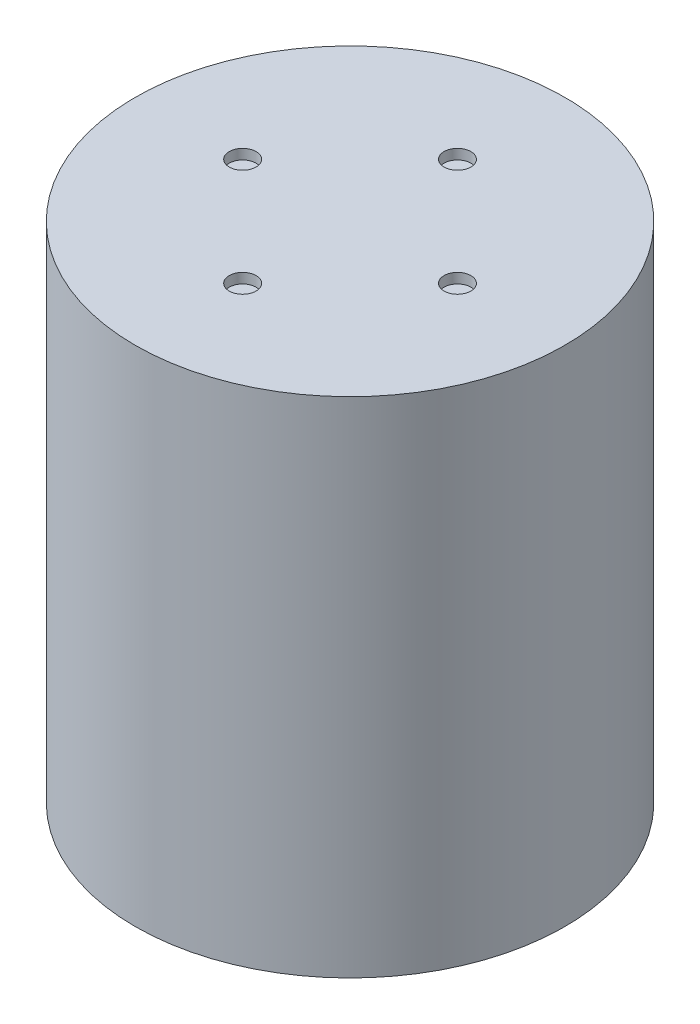
ISO-10303-21;
HEADER;
FILE_DESCRIPTION(('STEP AP214'),'2;1');
FILE_NAME('part.step','',(''),(''),'','','');
FILE_SCHEMA(('AUTOMOTIVE_DESIGN { 1 0 10303 214 1 1 1 1 }'));
ENDSEC;
DATA;
#1=APPLICATION_CONTEXT('core data for automotive mechanical design processes');
#2=APPLICATION_PROTOCOL_DEFINITION('international standard','automotive_design',2000,#1);
#3=PRODUCT_CONTEXT('',#1,'mechanical');
#4=PRODUCT('Part','Part','',(#3));
#5=PRODUCT_RELATED_PRODUCT_CATEGORY('part','',(#4));
#6=PRODUCT_DEFINITION_FORMATION('','',#4);
#7=PRODUCT_DEFINITION_CONTEXT('part definition',#1,'design');
#8=PRODUCT_DEFINITION('design','',#6,#7);
#9=PRODUCT_DEFINITION_SHAPE('','',#8);
#10=(LENGTH_UNIT() NAMED_UNIT(*) SI_UNIT(.MILLI.,.METRE.));
#11=(NAMED_UNIT(*) PLANE_ANGLE_UNIT() SI_UNIT($,.RADIAN.));
#12=(NAMED_UNIT(*) SI_UNIT($,.STERADIAN.) SOLID_ANGLE_UNIT());
#13=UNCERTAINTY_MEASURE_WITH_UNIT(LENGTH_MEASURE(1.E-05),#10,'distance_accuracy_value','');
#14=(GEOMETRIC_REPRESENTATION_CONTEXT(3) GLOBAL_UNCERTAINTY_ASSIGNED_CONTEXT((#13)) GLOBAL_UNIT_ASSIGNED_CONTEXT((#10,
#11,#12)) REPRESENTATION_CONTEXT('',''));
#15=CARTESIAN_POINT('',(0.,0.,0.));
#16=DIRECTION('',(0.,0.,1.));
#17=DIRECTION('',(1.,0.,0.));
#18=AXIS2_PLACEMENT_3D('',#15,#16,#17);
#19=CARTESIAN_POINT('',(0.,0.,0.));
#20=DIRECTION('',(0.,1.,0.));
#21=DIRECTION('',(0.,0.,1.));
#22=AXIS2_PLACEMENT_3D('',#19,#20,#21);
#23=PLANE('',#22);
#24=CARTESIAN_POINT('',(0.,0.,0.));
#25=DIRECTION('',(0.,1.,0.));
#26=DIRECTION('',(0.,0.,1.));
#27=AXIS2_PLACEMENT_3D('',#24,#25,#26);
#28=CIRCLE('',#27,32.);
#29=CARTESIAN_POINT('',(0.,0.,32.));
#30=VERTEX_POINT('',#29);
#31=EDGE_CURVE('E43',#30,#30,#28,.T.);
#32=ORIENTED_EDGE('',*,*,#31,.F.);
#33=EDGE_LOOP('',(#32));
#34=FACE_BOUND('',#33,.T.);
#35=CARTESIAN_POINT('',(-22.,0.,0.));
#36=DIRECTION('',(0.,-1.,0.));
#37=DIRECTION('',(0.,0.,-1.));
#38=AXIS2_PLACEMENT_3D('',#35,#36,#37);
#39=CIRCLE('',#38,2.);
#40=CARTESIAN_POINT('',(-22.,0.,-2.));
#41=VERTEX_POINT('',#40);
#42=EDGE_CURVE('E104',#41,#41,#39,.T.);
#43=ORIENTED_EDGE('',*,*,#42,.F.);
#44=EDGE_LOOP('',(#43));
#45=FACE_BOUND('',#44,.T.);
#46=CARTESIAN_POINT('',(0.,0.,-22.));
#47=DIRECTION('',(0.,-1.,0.));
#48=DIRECTION('',(0.,0.,-1.));
#49=AXIS2_PLACEMENT_3D('',#46,#47,#48);
#50=CIRCLE('',#49,2.);
#51=CARTESIAN_POINT('',(0.,0.,-24.));
#52=VERTEX_POINT('',#51);
#53=EDGE_CURVE('E122',#52,#52,#50,.T.);
#54=ORIENTED_EDGE('',*,*,#53,.F.);
#55=EDGE_LOOP('',(#54));
#56=FACE_BOUND('',#55,.T.);
#57=CARTESIAN_POINT('',(22.,0.,0.));
#58=DIRECTION('',(0.,-1.,0.));
#59=DIRECTION('',(0.,0.,-1.));
#60=AXIS2_PLACEMENT_3D('',#57,#58,#59);
#61=CIRCLE('',#60,2.);
#62=CARTESIAN_POINT('',(22.,0.,-2.));
#63=VERTEX_POINT('',#62);
#64=EDGE_CURVE('E116',#63,#63,#61,.T.);
#65=ORIENTED_EDGE('',*,*,#64,.F.);
#66=EDGE_LOOP('',(#65));
#67=FACE_BOUND('',#66,.T.);
#68=CARTESIAN_POINT('',(0.,0.,22.));
#69=DIRECTION('',(0.,-1.,0.));
#70=DIRECTION('',(0.,0.,-1.));
#71=AXIS2_PLACEMENT_3D('',#68,#69,#70);
#72=CIRCLE('',#71,2.);
#73=CARTESIAN_POINT('',(0.,0.,20.));
#74=VERTEX_POINT('',#73);
#75=EDGE_CURVE('E113',#74,#74,#72,.T.);
#76=ORIENTED_EDGE('',*,*,#75,.F.);
#77=EDGE_LOOP('',(#76));
#78=FACE_BOUND('',#77,.T.);
#79=CARTESIAN_POINT('',(12.7279220613578,0.,18.3847763108502));
#80=DIRECTION('',(0.,-1.,0.));
#81=DIRECTION('',(0.,0.,-1.));
#82=AXIS2_PLACEMENT_3D('',#79,#80,#81);
#83=CIRCLE('',#82,1.);
#84=CARTESIAN_POINT('',(13.4350288425444,0.,19.0918830920368));
#85=VERTEX_POINT('',#84);
#86=CARTESIAN_POINT('',(12.0208152801713,0.,17.6776695296637));
#87=VERTEX_POINT('',#86);
#88=EDGE_CURVE('E100',#85,#87,#83,.T.);
#89=ORIENTED_EDGE('',*,*,#88,.F.);
#90=DIRECTION('',(-0.707106781186547,0.,0.707106781186548));
#91=VECTOR('',#90,1.);
#92=CARTESIAN_POINT('',(13.4350288425444,0.,19.0918830920368));
#93=LINE('',#92,#91);
#94=CARTESIAN_POINT('',(19.0918830920368,0.,13.4350288425444));
#95=VERTEX_POINT('',#94);
#96=EDGE_CURVE('E97',#95,#85,#93,.T.);
#97=ORIENTED_EDGE('',*,*,#96,.F.);
#98=CARTESIAN_POINT('',(18.3847763108502,0.,12.7279220613579));
#99=DIRECTION('',(0.,-1.,0.));
#100=DIRECTION('',(0.,0.,-1.));
#101=AXIS2_PLACEMENT_3D('',#98,#99,#100);
#102=CIRCLE('',#101,0.999999999999999);
#103=CARTESIAN_POINT('',(17.6776695296637,0.,12.0208152801713));
#104=VERTEX_POINT('',#103);
#105=EDGE_CURVE('E59',#104,#95,#102,.T.);
#106=ORIENTED_EDGE('',*,*,#105,.F.);
#107=DIRECTION('',(0.707106781186547,0.,-0.707106781186547));
#108=VECTOR('',#107,1.);
#109=CARTESIAN_POINT('',(12.0208152801713,0.,17.6776695296637));
#110=LINE('',#109,#108);
#111=EDGE_CURVE('E54',#87,#104,#110,.T.);
#112=ORIENTED_EDGE('',*,*,#111,.F.);
#113=EDGE_LOOP('',(#89,#97,#106,#112));
#114=FACE_BOUND('',#113,.T.);
#115=ADVANCED_FACE('F39',(#34,#45,#56,#67,#78,#114),#23,.F.);
#116=CARTESIAN_POINT('',(0.,75.,0.));
#117=DIRECTION('',(0.,-1.,0.));
#118=DIRECTION('',(0.,0.,-1.));
#119=AXIS2_PLACEMENT_3D('',#116,#117,#118);
#120=CYLINDRICAL_SURFACE('',#119,32.);
#121=CARTESIAN_POINT('',(0.,75.,0.));
#122=DIRECTION('',(0.,1.,0.));
#123=DIRECTION('',(0.,0.,1.));
#124=AXIS2_PLACEMENT_3D('',#121,#122,#123);
#125=CIRCLE('',#124,32.);
#126=CARTESIAN_POINT('',(0.,75.,32.));
#127=VERTEX_POINT('',#126);
#128=EDGE_CURVE('E11',#127,#127,#125,.T.);
#129=ORIENTED_EDGE('',*,*,#128,.F.);
#130=EDGE_LOOP('',(#129));
#131=FACE_BOUND('',#130,.T.);
#132=ORIENTED_EDGE('',*,*,#31,.T.);
#133=EDGE_LOOP('',(#132));
#134=FACE_BOUND('',#133,.T.);
#135=ADVANCED_FACE('F41',(#131,#134),#120,.T.);
#136=CARTESIAN_POINT('',(0.,75.,0.));
#137=DIRECTION('',(0.,1.,0.));
#138=DIRECTION('',(0.,0.,1.));
#139=AXIS2_PLACEMENT_3D('',#136,#137,#138);
#140=PLANE('',#139);
#141=CARTESIAN_POINT('',(0.,75.,-16.));
#142=DIRECTION('',(0.,1.,0.));
#143=DIRECTION('',(0.,0.,1.));
#144=AXIS2_PLACEMENT_3D('',#141,#142,#143);
#145=CIRCLE('',#144,2.);
#146=CARTESIAN_POINT('',(0.,75.,-14.));
#147=VERTEX_POINT('',#146);
#148=EDGE_CURVE('E174',#147,#147,#145,.T.);
#149=ORIENTED_EDGE('',*,*,#148,.F.);
#150=EDGE_LOOP('',(#149));
#151=FACE_BOUND('',#150,.T.);
#152=CARTESIAN_POINT('',(16.,75.,0.));
#153=DIRECTION('',(0.,1.,0.));
#154=DIRECTION('',(0.,0.,1.));
#155=AXIS2_PLACEMENT_3D('',#152,#153,#154);
#156=CIRCLE('',#155,2.);
#157=CARTESIAN_POINT('',(16.,75.,2.));
#158=VERTEX_POINT('',#157);
#159=EDGE_CURVE('E171',#158,#158,#156,.T.);
#160=ORIENTED_EDGE('',*,*,#159,.F.);
#161=EDGE_LOOP('',(#160));
#162=FACE_BOUND('',#161,.T.);
#163=CARTESIAN_POINT('',(0.,75.,16.));
#164=DIRECTION('',(0.,1.,0.));
#165=DIRECTION('',(0.,0.,1.));
#166=AXIS2_PLACEMENT_3D('',#163,#164,#165);
#167=CIRCLE('',#166,2.);
#168=CARTESIAN_POINT('',(0.,75.,18.));
#169=VERTEX_POINT('',#168);
#170=EDGE_CURVE('E165',#169,#169,#167,.T.);
#171=ORIENTED_EDGE('',*,*,#170,.F.);
#172=EDGE_LOOP('',(#171));
#173=FACE_BOUND('',#172,.T.);
#174=CARTESIAN_POINT('',(-16.,75.,0.));
#175=DIRECTION('',(0.,1.,0.));
#176=DIRECTION('',(0.,0.,1.));
#177=AXIS2_PLACEMENT_3D('',#174,#175,#176);
#178=CIRCLE('',#177,2.);
#179=CARTESIAN_POINT('',(-16.,75.,2.));
#180=VERTEX_POINT('',#179);
#181=EDGE_CURVE('E159',#180,#180,#178,.T.);
#182=ORIENTED_EDGE('',*,*,#181,.F.);
#183=EDGE_LOOP('',(#182));
#184=FACE_BOUND('',#183,.T.);
#185=ORIENTED_EDGE('',*,*,#128,.T.);
#186=EDGE_LOOP('',(#185));
#187=FACE_BOUND('',#186,.T.);
#188=ADVANCED_FACE('F189',(#151,#162,#173,#184,#187),#140,.T.);
#189=CARTESIAN_POINT('',(-22.,1.5,0.));
#190=DIRECTION('',(0.,-1.,0.));
#191=DIRECTION('',(0.,0.,-1.));
#192=AXIS2_PLACEMENT_3D('',#189,#190,#191);
#193=CYLINDRICAL_SURFACE('',#192,2.);
#194=CARTESIAN_POINT('',(-22.,1.5,0.));
#195=DIRECTION('',(0.,-1.,0.));
#196=DIRECTION('',(0.,0.,-1.));
#197=AXIS2_PLACEMENT_3D('',#194,#195,#196);
#198=CIRCLE('',#197,2.);
#199=CARTESIAN_POINT('',(-22.,1.5,-2.));
#200=VERTEX_POINT('',#199);
#201=EDGE_CURVE('E101',#200,#200,#198,.T.);
#202=ORIENTED_EDGE('',*,*,#201,.F.);
#203=EDGE_LOOP('',(#202));
#204=FACE_BOUND('',#203,.T.);
#205=ORIENTED_EDGE('',*,*,#42,.T.);
#206=EDGE_LOOP('',(#205));
#207=FACE_BOUND('',#206,.T.);
#208=ADVANCED_FACE('F131',(#204,#207),#193,.F.);
#209=CARTESIAN_POINT('',(-22.,1.5,0.));
#210=DIRECTION('',(0.,-1.,0.));
#211=DIRECTION('',(0.,0.,-1.));
#212=AXIS2_PLACEMENT_3D('',#209,#210,#211);
#213=PLANE('',#212);
#214=ORIENTED_EDGE('',*,*,#201,.T.);
#215=EDGE_LOOP('',(#214));
#216=FACE_BOUND('',#215,.T.);
#217=ADVANCED_FACE('F215',(#216),#213,.T.);
#218=CARTESIAN_POINT('',(0.,1.5,-22.));
#219=DIRECTION('',(0.,-1.,0.));
#220=DIRECTION('',(0.,0.,-1.));
#221=AXIS2_PLACEMENT_3D('',#218,#219,#220);
#222=CYLINDRICAL_SURFACE('',#221,2.);
#223=CARTESIAN_POINT('',(0.,1.5,-22.));
#224=DIRECTION('',(0.,-1.,0.));
#225=DIRECTION('',(0.,0.,-1.));
#226=AXIS2_PLACEMENT_3D('',#223,#224,#225);
#227=CIRCLE('',#226,2.);
#228=CARTESIAN_POINT('',(0.,1.5,-24.));
#229=VERTEX_POINT('',#228);
#230=EDGE_CURVE('E125',#229,#229,#227,.T.);
#231=ORIENTED_EDGE('',*,*,#230,.F.);
#232=EDGE_LOOP('',(#231));
#233=FACE_BOUND('',#232,.T.);
#234=ORIENTED_EDGE('',*,*,#53,.T.);
#235=EDGE_LOOP('',(#234));
#236=FACE_BOUND('',#235,.T.);
#237=ADVANCED_FACE('F224',(#233,#236),#222,.F.);
#238=CARTESIAN_POINT('',(0.,1.5,-22.));
#239=DIRECTION('',(0.,-1.,0.));
#240=DIRECTION('',(0.,0.,-1.));
#241=AXIS2_PLACEMENT_3D('',#238,#239,#240);
#242=PLANE('',#241);
#243=ORIENTED_EDGE('',*,*,#230,.T.);
#244=EDGE_LOOP('',(#243));
#245=FACE_BOUND('',#244,.T.);
#246=ADVANCED_FACE('F233',(#245),#242,.T.);
#247=CARTESIAN_POINT('',(22.,1.5,0.));
#248=DIRECTION('',(0.,-1.,0.));
#249=DIRECTION('',(0.,0.,-1.));
#250=AXIS2_PLACEMENT_3D('',#247,#248,#249);
#251=CYLINDRICAL_SURFACE('',#250,2.);
#252=CARTESIAN_POINT('',(22.,1.5,0.));
#253=DIRECTION('',(0.,-1.,0.));
#254=DIRECTION('',(0.,0.,-1.));
#255=AXIS2_PLACEMENT_3D('',#252,#253,#254);
#256=CIRCLE('',#255,2.);
#257=CARTESIAN_POINT('',(22.,1.5,-2.));
#258=VERTEX_POINT('',#257);
#259=EDGE_CURVE('E119',#258,#258,#256,.T.);
#260=ORIENTED_EDGE('',*,*,#259,.F.);
#261=EDGE_LOOP('',(#260));
#262=FACE_BOUND('',#261,.T.);
#263=ORIENTED_EDGE('',*,*,#64,.T.);
#264=EDGE_LOOP('',(#263));
#265=FACE_BOUND('',#264,.T.);
#266=ADVANCED_FACE('F242',(#262,#265),#251,.F.);
#267=CARTESIAN_POINT('',(22.,1.5,0.));
#268=DIRECTION('',(0.,-1.,0.));
#269=DIRECTION('',(0.,0.,-1.));
#270=AXIS2_PLACEMENT_3D('',#267,#268,#269);
#271=PLANE('',#270);
#272=ORIENTED_EDGE('',*,*,#259,.T.);
#273=EDGE_LOOP('',(#272));
#274=FACE_BOUND('',#273,.T.);
#275=ADVANCED_FACE('F251',(#274),#271,.T.);
#276=CARTESIAN_POINT('',(0.,1.5,22.));
#277=DIRECTION('',(0.,-1.,0.));
#278=DIRECTION('',(0.,0.,-1.));
#279=AXIS2_PLACEMENT_3D('',#276,#277,#278);
#280=CYLINDRICAL_SURFACE('',#279,2.);
#281=CARTESIAN_POINT('',(0.,1.5,22.));
#282=DIRECTION('',(0.,-1.,0.));
#283=DIRECTION('',(0.,0.,-1.));
#284=AXIS2_PLACEMENT_3D('',#281,#282,#283);
#285=CIRCLE('',#284,2.);
#286=CARTESIAN_POINT('',(0.,1.5,20.));
#287=VERTEX_POINT('',#286);
#288=EDGE_CURVE('E110',#287,#287,#285,.T.);
#289=ORIENTED_EDGE('',*,*,#288,.F.);
#290=EDGE_LOOP('',(#289));
#291=FACE_BOUND('',#290,.T.);
#292=ORIENTED_EDGE('',*,*,#75,.T.);
#293=EDGE_LOOP('',(#292));
#294=FACE_BOUND('',#293,.T.);
#295=ADVANCED_FACE('F260',(#291,#294),#280,.F.);
#296=CARTESIAN_POINT('',(0.,1.5,22.));
#297=DIRECTION('',(0.,-1.,0.));
#298=DIRECTION('',(0.,0.,-1.));
#299=AXIS2_PLACEMENT_3D('',#296,#297,#298);
#300=PLANE('',#299);
#301=ORIENTED_EDGE('',*,*,#288,.T.);
#302=EDGE_LOOP('',(#301));
#303=FACE_BOUND('',#302,.T.);
#304=ADVANCED_FACE('F269',(#303),#300,.T.);
#305=CARTESIAN_POINT('',(12.7279220613578,-6.,18.3847763108502));
#306=DIRECTION('',(0.,1.,0.));
#307=DIRECTION('',(0.,0.,1.));
#308=AXIS2_PLACEMENT_3D('',#305,#306,#307);
#309=CYLINDRICAL_SURFACE('',#308,1.);
#310=ORIENTED_EDGE('',*,*,#88,.T.);
#311=DIRECTION('',(0.,1.,0.));
#312=VECTOR('',#311,1.);
#313=CARTESIAN_POINT('',(12.0208152801713,-6.,17.6776695296637));
#314=LINE('',#313,#312);
#315=CARTESIAN_POINT('',(12.0208152801713,-6.,17.6776695296637));
#316=VERTEX_POINT('',#315);
#317=EDGE_CURVE('E81',#316,#87,#314,.T.);
#318=ORIENTED_EDGE('',*,*,#317,.F.);
#319=CARTESIAN_POINT('',(12.7279220613578,-6.,18.3847763108502));
#320=DIRECTION('',(0.,-1.,0.));
#321=DIRECTION('',(0.,0.,-1.));
#322=AXIS2_PLACEMENT_3D('',#319,#320,#321);
#323=CIRCLE('',#322,1.);
#324=CARTESIAN_POINT('',(13.4350288425444,-6.,19.0918830920368));
#325=VERTEX_POINT('',#324);
#326=EDGE_CURVE('E88',#325,#316,#323,.T.);
#327=ORIENTED_EDGE('',*,*,#326,.F.);
#328=DIRECTION('',(0.,1.,0.));
#329=VECTOR('',#328,1.);
#330=CARTESIAN_POINT('',(13.4350288425444,-6.,19.0918830920368));
#331=LINE('',#330,#329);
#332=EDGE_CURVE('E147',#325,#85,#331,.T.);
#333=ORIENTED_EDGE('',*,*,#332,.T.);
#334=EDGE_LOOP('',(#310,#318,#327,#333));
#335=FACE_BOUND('',#334,.T.);
#336=ADVANCED_FACE('F99',(#335),#309,.T.);
#337=CARTESIAN_POINT('',(12.0208152801713,-6.,17.6776695296637));
#338=DIRECTION('',(0.707106781186548,0.,0.707106781186548));
#339=DIRECTION('',(0.707106781186548,0.,-0.707106781186548));
#340=AXIS2_PLACEMENT_3D('',#337,#338,#339);
#341=PLANE('',#340);
#342=ORIENTED_EDGE('',*,*,#111,.T.);
#343=DIRECTION('',(0.,1.,0.));
#344=VECTOR('',#343,1.);
#345=CARTESIAN_POINT('',(17.6776695296637,-6.,12.0208152801713));
#346=LINE('',#345,#344);
#347=CARTESIAN_POINT('',(17.6776695296637,-6.,12.0208152801713));
#348=VERTEX_POINT('',#347);
#349=EDGE_CURVE('E84',#348,#104,#346,.T.);
#350=ORIENTED_EDGE('',*,*,#349,.F.);
#351=DIRECTION('',(0.707106781186547,0.,-0.707106781186547));
#352=VECTOR('',#351,1.);
#353=CARTESIAN_POINT('',(12.0208152801713,-6.,17.6776695296637));
#354=LINE('',#353,#352);
#355=EDGE_CURVE('E77',#316,#348,#354,.T.);
#356=ORIENTED_EDGE('',*,*,#355,.F.);
#357=ORIENTED_EDGE('',*,*,#317,.T.);
#358=EDGE_LOOP('',(#342,#350,#356,#357));
#359=FACE_BOUND('',#358,.T.);
#360=ADVANCED_FACE('F79',(#359),#341,.F.);
#361=CARTESIAN_POINT('',(18.3847763108502,-6.,12.7279220613579));
#362=DIRECTION('',(0.,1.,0.));
#363=DIRECTION('',(0.,0.,1.));
#364=AXIS2_PLACEMENT_3D('',#361,#362,#363);
#365=CYLINDRICAL_SURFACE('',#364,0.999999999999999);
#366=ORIENTED_EDGE('',*,*,#105,.T.);
#367=DIRECTION('',(0.,1.,0.));
#368=VECTOR('',#367,1.);
#369=CARTESIAN_POINT('',(19.0918830920368,-6.,13.4350288425444));
#370=LINE('',#369,#368);
#371=CARTESIAN_POINT('',(19.0918830920368,-6.,13.4350288425444));
#372=VERTEX_POINT('',#371);
#373=EDGE_CURVE('E106',#372,#95,#370,.T.);
#374=ORIENTED_EDGE('',*,*,#373,.F.);
#375=CARTESIAN_POINT('',(18.3847763108502,-6.,12.7279220613579));
#376=DIRECTION('',(0.,-1.,0.));
#377=DIRECTION('',(0.,0.,-1.));
#378=AXIS2_PLACEMENT_3D('',#375,#376,#377);
#379=CIRCLE('',#378,0.999999999999999);
#380=EDGE_CURVE('E87',#348,#372,#379,.T.);
#381=ORIENTED_EDGE('',*,*,#380,.F.);
#382=ORIENTED_EDGE('',*,*,#349,.T.);
#383=EDGE_LOOP('',(#366,#374,#381,#382));
#384=FACE_BOUND('',#383,.T.);
#385=ADVANCED_FACE('F297',(#384),#365,.T.);
#386=CARTESIAN_POINT('',(13.4350288425444,-6.,19.0918830920368));
#387=DIRECTION('',(-0.707106781186548,0.,-0.707106781186547));
#388=DIRECTION('',(-0.707106781186547,0.,0.707106781186548));
#389=AXIS2_PLACEMENT_3D('',#386,#387,#388);
#390=PLANE('',#389);
#391=ORIENTED_EDGE('',*,*,#96,.T.);
#392=ORIENTED_EDGE('',*,*,#332,.F.);
#393=DIRECTION('',(-0.707106781186547,0.,0.707106781186548));
#394=VECTOR('',#393,1.);
#395=CARTESIAN_POINT('',(13.4350288425444,-6.,19.0918830920368));
#396=LINE('',#395,#394);
#397=EDGE_CURVE('E93',#372,#325,#396,.T.);
#398=ORIENTED_EDGE('',*,*,#397,.F.);
#399=ORIENTED_EDGE('',*,*,#373,.T.);
#400=EDGE_LOOP('',(#391,#392,#398,#399));
#401=FACE_BOUND('',#400,.T.);
#402=ADVANCED_FACE('F146',(#401),#390,.F.);
#403=CARTESIAN_POINT('',(12.7279220613578,-6.,18.3847763108502));
#404=DIRECTION('',(0.,-1.,0.));
#405=DIRECTION('',(0.,0.,-1.));
#406=AXIS2_PLACEMENT_3D('',#403,#404,#405);
#407=PLANE('',#406);
#408=ORIENTED_EDGE('',*,*,#326,.T.);
#409=ORIENTED_EDGE('',*,*,#355,.T.);
#410=ORIENTED_EDGE('',*,*,#380,.T.);
#411=ORIENTED_EDGE('',*,*,#397,.T.);
#412=EDGE_LOOP('',(#408,#409,#410,#411));
#413=FACE_BOUND('',#412,.T.);
#414=ADVANCED_FACE('F91',(#413),#407,.T.);
#415=CARTESIAN_POINT('',(-16.,73.5,0.));
#416=DIRECTION('',(0.,1.,0.));
#417=DIRECTION('',(0.,0.,1.));
#418=AXIS2_PLACEMENT_3D('',#415,#416,#417);
#419=CYLINDRICAL_SURFACE('',#418,2.);
#420=CARTESIAN_POINT('',(-16.,73.5,0.));
#421=DIRECTION('',(0.,1.,0.));
#422=DIRECTION('',(0.,0.,1.));
#423=AXIS2_PLACEMENT_3D('',#420,#421,#422);
#424=CIRCLE('',#423,2.);
#425=CARTESIAN_POINT('',(-16.,73.5,2.));
#426=VERTEX_POINT('',#425);
#427=EDGE_CURVE('E156',#426,#426,#424,.T.);
#428=ORIENTED_EDGE('',*,*,#427,.F.);
#429=EDGE_LOOP('',(#428));
#430=FACE_BOUND('',#429,.T.);
#431=ORIENTED_EDGE('',*,*,#181,.T.);
#432=EDGE_LOOP('',(#431));
#433=FACE_BOUND('',#432,.T.);
#434=ADVANCED_FACE('F319',(#430,#433),#419,.F.);
#435=CARTESIAN_POINT('',(-16.,73.5,0.));
#436=DIRECTION('',(0.,1.,0.));
#437=DIRECTION('',(0.,0.,1.));
#438=AXIS2_PLACEMENT_3D('',#435,#436,#437);
#439=PLANE('',#438);
#440=ORIENTED_EDGE('',*,*,#427,.T.);
#441=EDGE_LOOP('',(#440));
#442=FACE_BOUND('',#441,.T.);
#443=ADVANCED_FACE('F332',(#442),#439,.T.);
#444=CARTESIAN_POINT('',(0.,73.5,16.));
#445=DIRECTION('',(0.,1.,0.));
#446=DIRECTION('',(0.,0.,1.));
#447=AXIS2_PLACEMENT_3D('',#444,#445,#446);
#448=CYLINDRICAL_SURFACE('',#447,2.);
#449=CARTESIAN_POINT('',(0.,73.5,16.));
#450=DIRECTION('',(0.,1.,0.));
#451=DIRECTION('',(0.,0.,1.));
#452=AXIS2_PLACEMENT_3D('',#449,#450,#451);
#453=CIRCLE('',#452,2.);
#454=CARTESIAN_POINT('',(0.,73.5,18.));
#455=VERTEX_POINT('',#454);
#456=EDGE_CURVE('E162',#455,#455,#453,.T.);
#457=ORIENTED_EDGE('',*,*,#456,.F.);
#458=EDGE_LOOP('',(#457));
#459=FACE_BOUND('',#458,.T.);
#460=ORIENTED_EDGE('',*,*,#170,.T.);
#461=EDGE_LOOP('',(#460));
#462=FACE_BOUND('',#461,.T.);
#463=ADVANCED_FACE('F341',(#459,#462),#448,.F.);
#464=CARTESIAN_POINT('',(0.,73.5,16.));
#465=DIRECTION('',(0.,1.,0.));
#466=DIRECTION('',(0.,0.,1.));
#467=AXIS2_PLACEMENT_3D('',#464,#465,#466);
#468=PLANE('',#467);
#469=ORIENTED_EDGE('',*,*,#456,.T.);
#470=EDGE_LOOP('',(#469));
#471=FACE_BOUND('',#470,.T.);
#472=ADVANCED_FACE('F350',(#471),#468,.T.);
#473=CARTESIAN_POINT('',(16.,73.5,0.));
#474=DIRECTION('',(0.,1.,0.));
#475=DIRECTION('',(0.,0.,1.));
#476=AXIS2_PLACEMENT_3D('',#473,#474,#475);
#477=CYLINDRICAL_SURFACE('',#476,2.);
#478=CARTESIAN_POINT('',(16.,73.5,0.));
#479=DIRECTION('',(0.,1.,0.));
#480=DIRECTION('',(0.,0.,1.));
#481=AXIS2_PLACEMENT_3D('',#478,#479,#480);
#482=CIRCLE('',#481,2.);
#483=CARTESIAN_POINT('',(16.,73.5,2.));
#484=VERTEX_POINT('',#483);
#485=EDGE_CURVE('E168',#484,#484,#482,.T.);
#486=ORIENTED_EDGE('',*,*,#485,.F.);
#487=EDGE_LOOP('',(#486));
#488=FACE_BOUND('',#487,.T.);
#489=ORIENTED_EDGE('',*,*,#159,.T.);
#490=EDGE_LOOP('',(#489));
#491=FACE_BOUND('',#490,.T.);
#492=ADVANCED_FACE('F359',(#488,#491),#477,.F.);
#493=CARTESIAN_POINT('',(16.,73.5,0.));
#494=DIRECTION('',(0.,1.,0.));
#495=DIRECTION('',(0.,0.,1.));
#496=AXIS2_PLACEMENT_3D('',#493,#494,#495);
#497=PLANE('',#496);
#498=ORIENTED_EDGE('',*,*,#485,.T.);
#499=EDGE_LOOP('',(#498));
#500=FACE_BOUND('',#499,.T.);
#501=ADVANCED_FACE('F185',(#500),#497,.T.);
#502=CARTESIAN_POINT('',(0.,73.5,-16.));
#503=DIRECTION('',(0.,1.,0.));
#504=DIRECTION('',(0.,0.,1.));
#505=AXIS2_PLACEMENT_3D('',#502,#503,#504);
#506=CYLINDRICAL_SURFACE('',#505,2.);
#507=CARTESIAN_POINT('',(0.,73.5,-16.));
#508=DIRECTION('',(0.,1.,0.));
#509=DIRECTION('',(0.,0.,1.));
#510=AXIS2_PLACEMENT_3D('',#507,#508,#509);
#511=CIRCLE('',#510,2.);
#512=CARTESIAN_POINT('',(0.,73.5,-14.));
#513=VERTEX_POINT('',#512);
#514=EDGE_CURVE('E142',#513,#513,#511,.T.);
#515=ORIENTED_EDGE('',*,*,#514,.F.);
#516=EDGE_LOOP('',(#515));
#517=FACE_BOUND('',#516,.T.);
#518=ORIENTED_EDGE('',*,*,#148,.T.);
#519=EDGE_LOOP('',(#518));
#520=FACE_BOUND('',#519,.T.);
#521=ADVANCED_FACE('F182',(#517,#520),#506,.F.);
#522=CARTESIAN_POINT('',(0.,73.5,-16.));
#523=DIRECTION('',(0.,1.,0.));
#524=DIRECTION('',(0.,0.,1.));
#525=AXIS2_PLACEMENT_3D('',#522,#523,#524);
#526=PLANE('',#525);
#527=ORIENTED_EDGE('',*,*,#514,.T.);
#528=EDGE_LOOP('',(#527));
#529=FACE_BOUND('',#528,.T.);
#530=ADVANCED_FACE('F180',(#529),#526,.T.);
#531=CLOSED_SHELL('',(#115,#135,#188,#208,#217,#237,#246,#266,#275,#295,#304,#336,#360,#385,
#402,#414,#434,#443,#463,#472,#492,#501,#521,#530));
#532=MANIFOLD_SOLID_BREP('B2',#531);
#533=ADVANCED_BREP_SHAPE_REPRESENTATION('',(#18,#532),#14);
#534=SHAPE_DEFINITION_REPRESENTATION(#9,#533);
ENDSEC;
END-ISO-10303-21;
